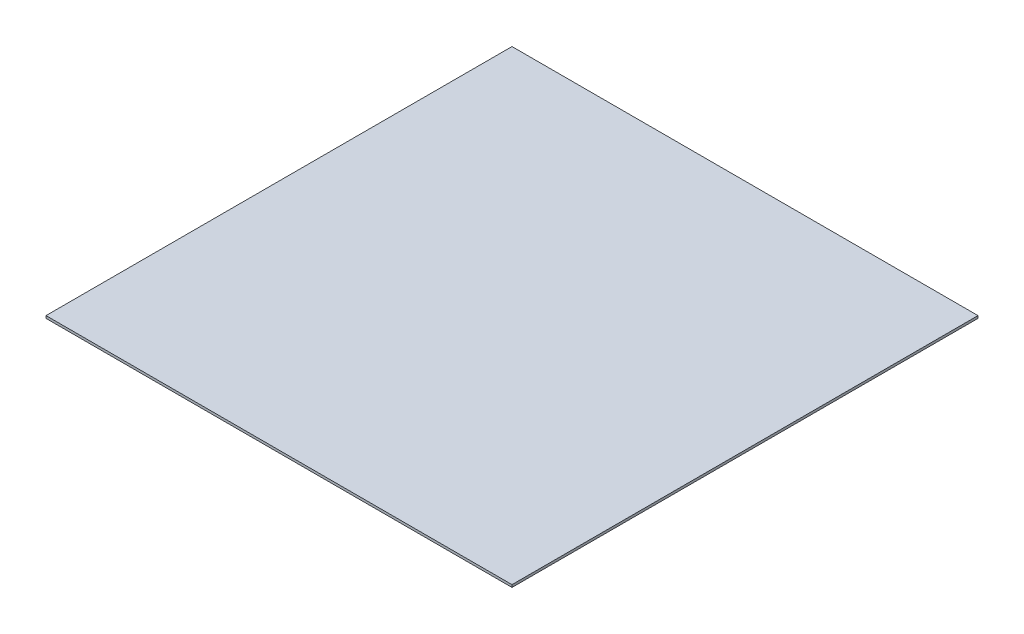
ISO-10303-21;
HEADER;
FILE_DESCRIPTION(('STEP AP214'),'2;1');
FILE_NAME('part.step','',(''),(''),'','','');
FILE_SCHEMA(('AUTOMOTIVE_DESIGN { 1 0 10303 214 1 1 1 1 }'));
ENDSEC;
DATA;
#1=APPLICATION_CONTEXT('core data for automotive mechanical design processes');
#2=APPLICATION_PROTOCOL_DEFINITION('international standard','automotive_design',2000,#1);
#3=PRODUCT_CONTEXT('',#1,'mechanical');
#4=PRODUCT('Part','Part','',(#3));
#5=PRODUCT_RELATED_PRODUCT_CATEGORY('part','',(#4));
#6=PRODUCT_DEFINITION_FORMATION('','',#4);
#7=PRODUCT_DEFINITION_CONTEXT('part definition',#1,'design');
#8=PRODUCT_DEFINITION('design','',#6,#7);
#9=PRODUCT_DEFINITION_SHAPE('','',#8);
#10=(LENGTH_UNIT() NAMED_UNIT(*) SI_UNIT(.MILLI.,.METRE.));
#11=(NAMED_UNIT(*) PLANE_ANGLE_UNIT() SI_UNIT($,.RADIAN.));
#12=(NAMED_UNIT(*) SI_UNIT($,.STERADIAN.) SOLID_ANGLE_UNIT());
#13=UNCERTAINTY_MEASURE_WITH_UNIT(LENGTH_MEASURE(1.E-05),#10,'distance_accuracy_value','');
#14=(GEOMETRIC_REPRESENTATION_CONTEXT(3) GLOBAL_UNCERTAINTY_ASSIGNED_CONTEXT((#13)) GLOBAL_UNIT_ASSIGNED_CONTEXT((#10,
#11,#12)) REPRESENTATION_CONTEXT('',''));
#15=CARTESIAN_POINT('',(0.,0.,0.));
#16=DIRECTION('',(0.,0.,1.));
#17=DIRECTION('',(1.,0.,0.));
#18=AXIS2_PLACEMENT_3D('',#15,#16,#17);
#19=CARTESIAN_POINT('',(-144.78,1.524,144.78));
#20=DIRECTION('',(1.,0.,0.));
#21=DIRECTION('',(0.,0.,-1.));
#22=AXIS2_PLACEMENT_3D('',#19,#20,#21);
#23=PLANE('',#22);
#24=DIRECTION('',(0.,0.,1.));
#25=VECTOR('',#24,1.);
#26=CARTESIAN_POINT('',(-144.78,0.,144.78));
#27=LINE('',#26,#25);
#28=CARTESIAN_POINT('',(-144.78,0.,-144.78));
#29=VERTEX_POINT('',#28);
#30=CARTESIAN_POINT('',(-144.78,0.,144.78));
#31=VERTEX_POINT('',#30);
#32=EDGE_CURVE('E95',#29,#31,#27,.T.);
#33=ORIENTED_EDGE('',*,*,#32,.T.);
#34=DIRECTION('',(0.,-1.,0.));
#35=VECTOR('',#34,1.);
#36=CARTESIAN_POINT('',(-144.78,1.524,144.78));
#37=LINE('',#36,#35);
#38=CARTESIAN_POINT('',(-144.78,1.524,144.78));
#39=VERTEX_POINT('',#38);
#40=EDGE_CURVE('E11',#39,#31,#37,.T.);
#41=ORIENTED_EDGE('',*,*,#40,.F.);
#42=DIRECTION('',(0.,0.,1.));
#43=VECTOR('',#42,1.);
#44=CARTESIAN_POINT('',(-144.78,1.524,144.78));
#45=LINE('',#44,#43);
#46=CARTESIAN_POINT('',(-144.78,1.524,-144.78));
#47=VERTEX_POINT('',#46);
#48=EDGE_CURVE('E83',#47,#39,#45,.T.);
#49=ORIENTED_EDGE('',*,*,#48,.F.);
#50=DIRECTION('',(0.,-1.,0.));
#51=VECTOR('',#50,1.);
#52=CARTESIAN_POINT('',(-144.78,1.524,-144.78));
#53=LINE('',#52,#51);
#54=EDGE_CURVE('E91',#47,#29,#53,.T.);
#55=ORIENTED_EDGE('',*,*,#54,.T.);
#56=EDGE_LOOP('',(#33,#41,#49,#55));
#57=FACE_BOUND('',#56,.T.);
#58=ADVANCED_FACE('F32',(#57),#23,.F.);
#59=CARTESIAN_POINT('',(144.78,1.524,144.78));
#60=DIRECTION('',(0.,0.,-1.));
#61=DIRECTION('',(-1.,0.,0.));
#62=AXIS2_PLACEMENT_3D('',#59,#60,#61);
#63=PLANE('',#62);
#64=DIRECTION('',(1.,0.,0.));
#65=VECTOR('',#64,1.);
#66=CARTESIAN_POINT('',(144.78,0.,144.78));
#67=LINE('',#66,#65);
#68=CARTESIAN_POINT('',(144.78,0.,144.78));
#69=VERTEX_POINT('',#68);
#70=EDGE_CURVE('E87',#31,#69,#67,.T.);
#71=ORIENTED_EDGE('',*,*,#70,.T.);
#72=DIRECTION('',(0.,-1.,0.));
#73=VECTOR('',#72,1.);
#74=CARTESIAN_POINT('',(144.78,1.524,144.78));
#75=LINE('',#74,#73);
#76=CARTESIAN_POINT('',(144.78,1.524,144.78));
#77=VERTEX_POINT('',#76);
#78=EDGE_CURVE('E40',#77,#69,#75,.T.);
#79=ORIENTED_EDGE('',*,*,#78,.F.);
#80=DIRECTION('',(1.,0.,0.));
#81=VECTOR('',#80,1.);
#82=CARTESIAN_POINT('',(144.78,1.524,144.78));
#83=LINE('',#82,#81);
#84=EDGE_CURVE('E78',#39,#77,#83,.T.);
#85=ORIENTED_EDGE('',*,*,#84,.F.);
#86=ORIENTED_EDGE('',*,*,#40,.T.);
#87=EDGE_LOOP('',(#71,#79,#85,#86));
#88=FACE_BOUND('',#87,.T.);
#89=ADVANCED_FACE('F86',(#88),#63,.F.);
#90=CARTESIAN_POINT('',(144.78,1.524,144.78));
#91=DIRECTION('',(-1.,0.,0.));
#92=DIRECTION('',(0.,0.,1.));
#93=AXIS2_PLACEMENT_3D('',#90,#91,#92);
#94=PLANE('',#93);
#95=DIRECTION('',(0.,0.,-1.));
#96=VECTOR('',#95,1.);
#97=CARTESIAN_POINT('',(144.78,0.,144.78));
#98=LINE('',#97,#96);
#99=CARTESIAN_POINT('',(144.78,0.,-144.78));
#100=VERTEX_POINT('',#99);
#101=EDGE_CURVE('E65',#69,#100,#98,.T.);
#102=ORIENTED_EDGE('',*,*,#101,.T.);
#103=DIRECTION('',(0.,-1.,0.));
#104=VECTOR('',#103,1.);
#105=CARTESIAN_POINT('',(144.78,1.524,-144.78));
#106=LINE('',#105,#104);
#107=CARTESIAN_POINT('',(144.78,1.524,-144.78));
#108=VERTEX_POINT('',#107);
#109=EDGE_CURVE('E88',#108,#100,#106,.T.);
#110=ORIENTED_EDGE('',*,*,#109,.F.);
#111=DIRECTION('',(0.,0.,-1.));
#112=VECTOR('',#111,1.);
#113=CARTESIAN_POINT('',(144.78,1.524,144.78));
#114=LINE('',#113,#112);
#115=EDGE_CURVE('E81',#77,#108,#114,.T.);
#116=ORIENTED_EDGE('',*,*,#115,.F.);
#117=ORIENTED_EDGE('',*,*,#78,.T.);
#118=EDGE_LOOP('',(#102,#110,#116,#117));
#119=FACE_BOUND('',#118,.T.);
#120=ADVANCED_FACE('F89',(#119),#94,.F.);
#121=CARTESIAN_POINT('',(144.78,1.524,-144.78));
#122=DIRECTION('',(0.,0.,1.));
#123=DIRECTION('',(1.,0.,0.));
#124=AXIS2_PLACEMENT_3D('',#121,#122,#123);
#125=PLANE('',#124);
#126=DIRECTION('',(-1.,0.,0.));
#127=VECTOR('',#126,1.);
#128=CARTESIAN_POINT('',(144.78,0.,-144.78));
#129=LINE('',#128,#127);
#130=EDGE_CURVE('E71',#100,#29,#129,.T.);
#131=ORIENTED_EDGE('',*,*,#130,.T.);
#132=ORIENTED_EDGE('',*,*,#54,.F.);
#133=DIRECTION('',(-1.,0.,0.));
#134=VECTOR('',#133,1.);
#135=CARTESIAN_POINT('',(144.78,1.524,-144.78));
#136=LINE('',#135,#134);
#137=EDGE_CURVE('E48',#108,#47,#136,.T.);
#138=ORIENTED_EDGE('',*,*,#137,.F.);
#139=ORIENTED_EDGE('',*,*,#109,.T.);
#140=EDGE_LOOP('',(#131,#132,#138,#139));
#141=FACE_BOUND('',#140,.T.);
#142=ADVANCED_FACE('F102',(#141),#125,.F.);
#143=CARTESIAN_POINT('',(0.,1.524,0.));
#144=DIRECTION('',(0.,1.,0.));
#145=DIRECTION('',(0.,0.,1.));
#146=AXIS2_PLACEMENT_3D('',#143,#144,#145);
#147=PLANE('',#146);
#148=ORIENTED_EDGE('',*,*,#48,.T.);
#149=ORIENTED_EDGE('',*,*,#84,.T.);
#150=ORIENTED_EDGE('',*,*,#115,.T.);
#151=ORIENTED_EDGE('',*,*,#137,.T.);
#152=EDGE_LOOP('',(#148,#149,#150,#151));
#153=FACE_BOUND('',#152,.T.);
#154=ADVANCED_FACE('F79',(#153),#147,.T.);
#155=CARTESIAN_POINT('',(0.,0.,0.));
#156=DIRECTION('',(0.,1.,0.));
#157=DIRECTION('',(0.,0.,1.));
#158=AXIS2_PLACEMENT_3D('',#155,#156,#157);
#159=PLANE('',#158);
#160=ORIENTED_EDGE('',*,*,#32,.F.);
#161=ORIENTED_EDGE('',*,*,#130,.F.);
#162=ORIENTED_EDGE('',*,*,#101,.F.);
#163=ORIENTED_EDGE('',*,*,#70,.F.);
#164=EDGE_LOOP('',(#160,#161,#162,#163));
#165=FACE_BOUND('',#164,.T.);
#166=ADVANCED_FACE('F105',(#165),#159,.F.);
#167=CLOSED_SHELL('',(#58,#89,#120,#142,#154,#166));
#168=MANIFOLD_SOLID_BREP('B2',#167);
#169=ADVANCED_BREP_SHAPE_REPRESENTATION('',(#18,#168),#14);
#170=SHAPE_DEFINITION_REPRESENTATION(#9,#169);
ENDSEC;
END-ISO-10303-21;
